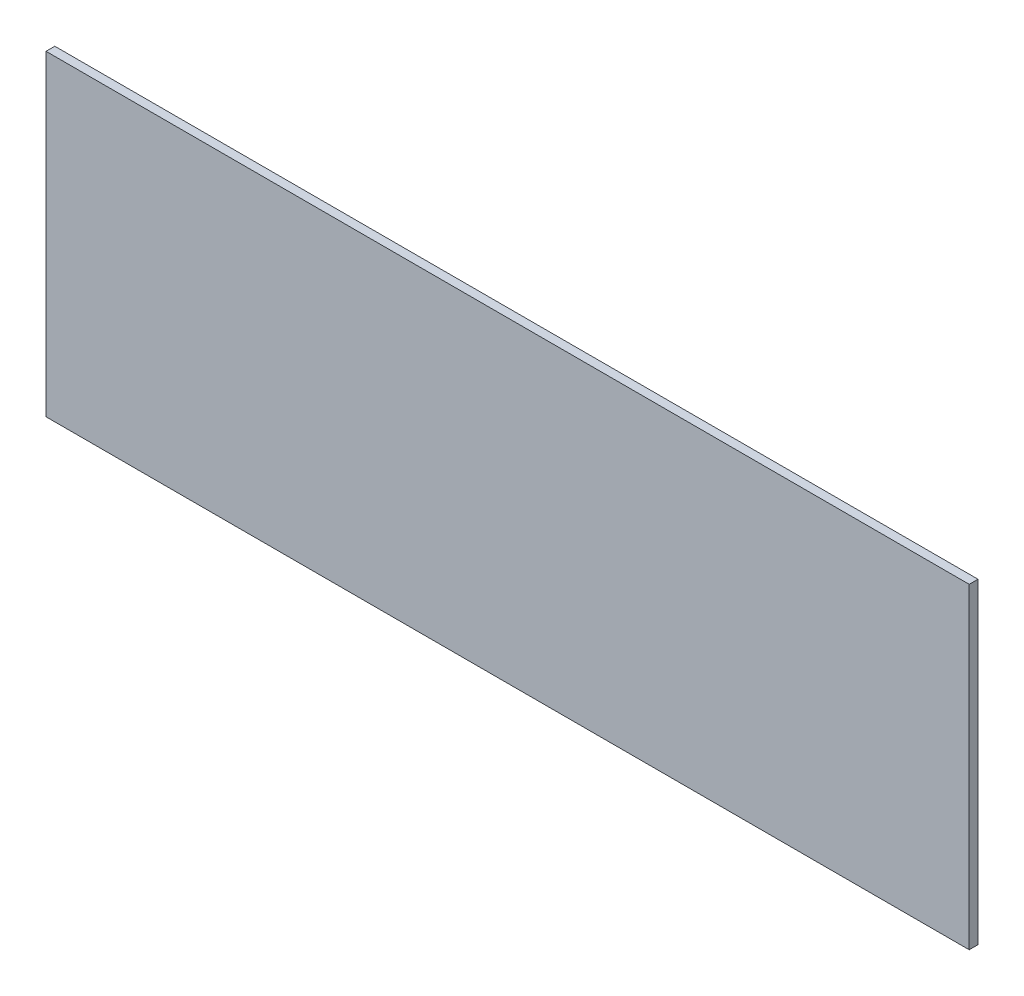
ISO-10303-21;
HEADER;
FILE_DESCRIPTION(('STEP AP214'),'2;1');
FILE_NAME('part.step','',(''),(''),'','','');
FILE_SCHEMA(('AUTOMOTIVE_DESIGN { 1 0 10303 214 1 1 1 1 }'));
ENDSEC;
DATA;
#1=APPLICATION_CONTEXT('core data for automotive mechanical design processes');
#2=APPLICATION_PROTOCOL_DEFINITION('international standard','automotive_design',2000,#1);
#3=PRODUCT_CONTEXT('',#1,'mechanical');
#4=PRODUCT('Part','Part','',(#3));
#5=PRODUCT_RELATED_PRODUCT_CATEGORY('part','',(#4));
#6=PRODUCT_DEFINITION_FORMATION('','',#4);
#7=PRODUCT_DEFINITION_CONTEXT('part definition',#1,'design');
#8=PRODUCT_DEFINITION('design','',#6,#7);
#9=PRODUCT_DEFINITION_SHAPE('','',#8);
#10=(LENGTH_UNIT() NAMED_UNIT(*) SI_UNIT(.MILLI.,.METRE.));
#11=(NAMED_UNIT(*) PLANE_ANGLE_UNIT() SI_UNIT($,.RADIAN.));
#12=(NAMED_UNIT(*) SI_UNIT($,.STERADIAN.) SOLID_ANGLE_UNIT());
#13=UNCERTAINTY_MEASURE_WITH_UNIT(LENGTH_MEASURE(1.E-05),#10,'distance_accuracy_value','');
#14=(GEOMETRIC_REPRESENTATION_CONTEXT(3) GLOBAL_UNCERTAINTY_ASSIGNED_CONTEXT((#13)) GLOBAL_UNIT_ASSIGNED_CONTEXT((#10,
#11,#12)) REPRESENTATION_CONTEXT('',''));
#15=CARTESIAN_POINT('',(0.,0.,0.));
#16=DIRECTION('',(0.,0.,1.));
#17=DIRECTION('',(1.,0.,0.));
#18=AXIS2_PLACEMENT_3D('',#15,#16,#17);
#19=CARTESIAN_POINT('',(105.,-36.,2.));
#20=DIRECTION('',(-1.,0.,0.));
#21=DIRECTION('',(0.,0.,1.));
#22=AXIS2_PLACEMENT_3D('',#19,#20,#21);
#23=PLANE('',#22);
#24=DIRECTION('',(0.,1.,0.));
#25=VECTOR('',#24,1.);
#26=CARTESIAN_POINT('',(105.,-36.,0.));
#27=LINE('',#26,#25);
#28=CARTESIAN_POINT('',(105.,-36.,0.));
#29=VERTEX_POINT('',#28);
#30=CARTESIAN_POINT('',(105.,36.,0.));
#31=VERTEX_POINT('',#30);
#32=EDGE_CURVE('E96',#29,#31,#27,.T.);
#33=ORIENTED_EDGE('',*,*,#32,.T.);
#34=DIRECTION('',(0.,0.,-1.));
#35=VECTOR('',#34,1.);
#36=CARTESIAN_POINT('',(105.,36.,2.));
#37=LINE('',#36,#35);
#38=CARTESIAN_POINT('',(105.,36.,2.));
#39=VERTEX_POINT('',#38);
#40=EDGE_CURVE('E11',#39,#31,#37,.T.);
#41=ORIENTED_EDGE('',*,*,#40,.F.);
#42=DIRECTION('',(0.,1.,0.));
#43=VECTOR('',#42,1.);
#44=CARTESIAN_POINT('',(105.,-36.,2.));
#45=LINE('',#44,#43);
#46=CARTESIAN_POINT('',(105.,-36.,2.));
#47=VERTEX_POINT('',#46);
#48=EDGE_CURVE('E84',#47,#39,#45,.T.);
#49=ORIENTED_EDGE('',*,*,#48,.F.);
#50=DIRECTION('',(0.,0.,-1.));
#51=VECTOR('',#50,1.);
#52=CARTESIAN_POINT('',(105.,-36.,2.));
#53=LINE('',#52,#51);
#54=EDGE_CURVE('E92',#47,#29,#53,.T.);
#55=ORIENTED_EDGE('',*,*,#54,.T.);
#56=EDGE_LOOP('',(#33,#41,#49,#55));
#57=FACE_BOUND('',#56,.T.);
#58=ADVANCED_FACE('F33',(#57),#23,.F.);
#59=CARTESIAN_POINT('',(-105.,36.,2.));
#60=DIRECTION('',(0.,-1.,0.));
#61=DIRECTION('',(0.,0.,-1.));
#62=AXIS2_PLACEMENT_3D('',#59,#60,#61);
#63=PLANE('',#62);
#64=DIRECTION('',(-1.,0.,0.));
#65=VECTOR('',#64,1.);
#66=CARTESIAN_POINT('',(-105.,36.,0.));
#67=LINE('',#66,#65);
#68=CARTESIAN_POINT('',(-105.,36.,0.));
#69=VERTEX_POINT('',#68);
#70=EDGE_CURVE('E88',#31,#69,#67,.T.);
#71=ORIENTED_EDGE('',*,*,#70,.T.);
#72=DIRECTION('',(0.,0.,-1.));
#73=VECTOR('',#72,1.);
#74=CARTESIAN_POINT('',(-105.,36.,2.));
#75=LINE('',#74,#73);
#76=CARTESIAN_POINT('',(-105.,36.,2.));
#77=VERTEX_POINT('',#76);
#78=EDGE_CURVE('E41',#77,#69,#75,.T.);
#79=ORIENTED_EDGE('',*,*,#78,.F.);
#80=DIRECTION('',(-1.,0.,0.));
#81=VECTOR('',#80,1.);
#82=CARTESIAN_POINT('',(-105.,36.,2.));
#83=LINE('',#82,#81);
#84=EDGE_CURVE('E79',#39,#77,#83,.T.);
#85=ORIENTED_EDGE('',*,*,#84,.F.);
#86=ORIENTED_EDGE('',*,*,#40,.T.);
#87=EDGE_LOOP('',(#71,#79,#85,#86));
#88=FACE_BOUND('',#87,.T.);
#89=ADVANCED_FACE('F87',(#88),#63,.F.);
#90=CARTESIAN_POINT('',(-105.,-36.,2.));
#91=DIRECTION('',(1.,0.,0.));
#92=DIRECTION('',(0.,0.,-1.));
#93=AXIS2_PLACEMENT_3D('',#90,#91,#92);
#94=PLANE('',#93);
#95=DIRECTION('',(0.,-1.,0.));
#96=VECTOR('',#95,1.);
#97=CARTESIAN_POINT('',(-105.,-36.,0.));
#98=LINE('',#97,#96);
#99=CARTESIAN_POINT('',(-105.,-36.,0.));
#100=VERTEX_POINT('',#99);
#101=EDGE_CURVE('E66',#69,#100,#98,.T.);
#102=ORIENTED_EDGE('',*,*,#101,.T.);
#103=DIRECTION('',(0.,0.,-1.));
#104=VECTOR('',#103,1.);
#105=CARTESIAN_POINT('',(-105.,-36.,2.));
#106=LINE('',#105,#104);
#107=CARTESIAN_POINT('',(-105.,-36.,2.));
#108=VERTEX_POINT('',#107);
#109=EDGE_CURVE('E89',#108,#100,#106,.T.);
#110=ORIENTED_EDGE('',*,*,#109,.F.);
#111=DIRECTION('',(0.,-1.,0.));
#112=VECTOR('',#111,1.);
#113=CARTESIAN_POINT('',(-105.,-36.,2.));
#114=LINE('',#113,#112);
#115=EDGE_CURVE('E82',#77,#108,#114,.T.);
#116=ORIENTED_EDGE('',*,*,#115,.F.);
#117=ORIENTED_EDGE('',*,*,#78,.T.);
#118=EDGE_LOOP('',(#102,#110,#116,#117));
#119=FACE_BOUND('',#118,.T.);
#120=ADVANCED_FACE('F90',(#119),#94,.F.);
#121=CARTESIAN_POINT('',(-105.,-36.,2.));
#122=DIRECTION('',(0.,1.,0.));
#123=DIRECTION('',(0.,0.,1.));
#124=AXIS2_PLACEMENT_3D('',#121,#122,#123);
#125=PLANE('',#124);
#126=DIRECTION('',(1.,0.,0.));
#127=VECTOR('',#126,1.);
#128=CARTESIAN_POINT('',(-105.,-36.,0.));
#129=LINE('',#128,#127);
#130=EDGE_CURVE('E72',#100,#29,#129,.T.);
#131=ORIENTED_EDGE('',*,*,#130,.T.);
#132=ORIENTED_EDGE('',*,*,#54,.F.);
#133=DIRECTION('',(1.,0.,0.));
#134=VECTOR('',#133,1.);
#135=CARTESIAN_POINT('',(-105.,-36.,2.));
#136=LINE('',#135,#134);
#137=EDGE_CURVE('E49',#108,#47,#136,.T.);
#138=ORIENTED_EDGE('',*,*,#137,.F.);
#139=ORIENTED_EDGE('',*,*,#109,.T.);
#140=EDGE_LOOP('',(#131,#132,#138,#139));
#141=FACE_BOUND('',#140,.T.);
#142=ADVANCED_FACE('F103',(#141),#125,.F.);
#143=CARTESIAN_POINT('',(0.,0.,2.));
#144=DIRECTION('',(0.,0.,-1.));
#145=DIRECTION('',(-1.,0.,0.));
#146=AXIS2_PLACEMENT_3D('',#143,#144,#145);
#147=PLANE('',#146);
#148=ORIENTED_EDGE('',*,*,#48,.T.);
#149=ORIENTED_EDGE('',*,*,#84,.T.);
#150=ORIENTED_EDGE('',*,*,#115,.T.);
#151=ORIENTED_EDGE('',*,*,#137,.T.);
#152=EDGE_LOOP('',(#148,#149,#150,#151));
#153=FACE_BOUND('',#152,.T.);
#154=ADVANCED_FACE('F80',(#153),#147,.F.);
#155=CARTESIAN_POINT('',(0.,0.,0.));
#156=DIRECTION('',(0.,0.,-1.));
#157=DIRECTION('',(-1.,0.,0.));
#158=AXIS2_PLACEMENT_3D('',#155,#156,#157);
#159=PLANE('',#158);
#160=ORIENTED_EDGE('',*,*,#32,.F.);
#161=ORIENTED_EDGE('',*,*,#130,.F.);
#162=ORIENTED_EDGE('',*,*,#101,.F.);
#163=ORIENTED_EDGE('',*,*,#70,.F.);
#164=EDGE_LOOP('',(#160,#161,#162,#163));
#165=FACE_BOUND('',#164,.T.);
#166=ADVANCED_FACE('F106',(#165),#159,.T.);
#167=CLOSED_SHELL('',(#58,#89,#120,#142,#154,#166));
#168=MANIFOLD_SOLID_BREP('B2',#167);
#169=ADVANCED_BREP_SHAPE_REPRESENTATION('',(#18,#168),#14);
#170=SHAPE_DEFINITION_REPRESENTATION(#9,#169);
ENDSEC;
END-ISO-10303-21;
